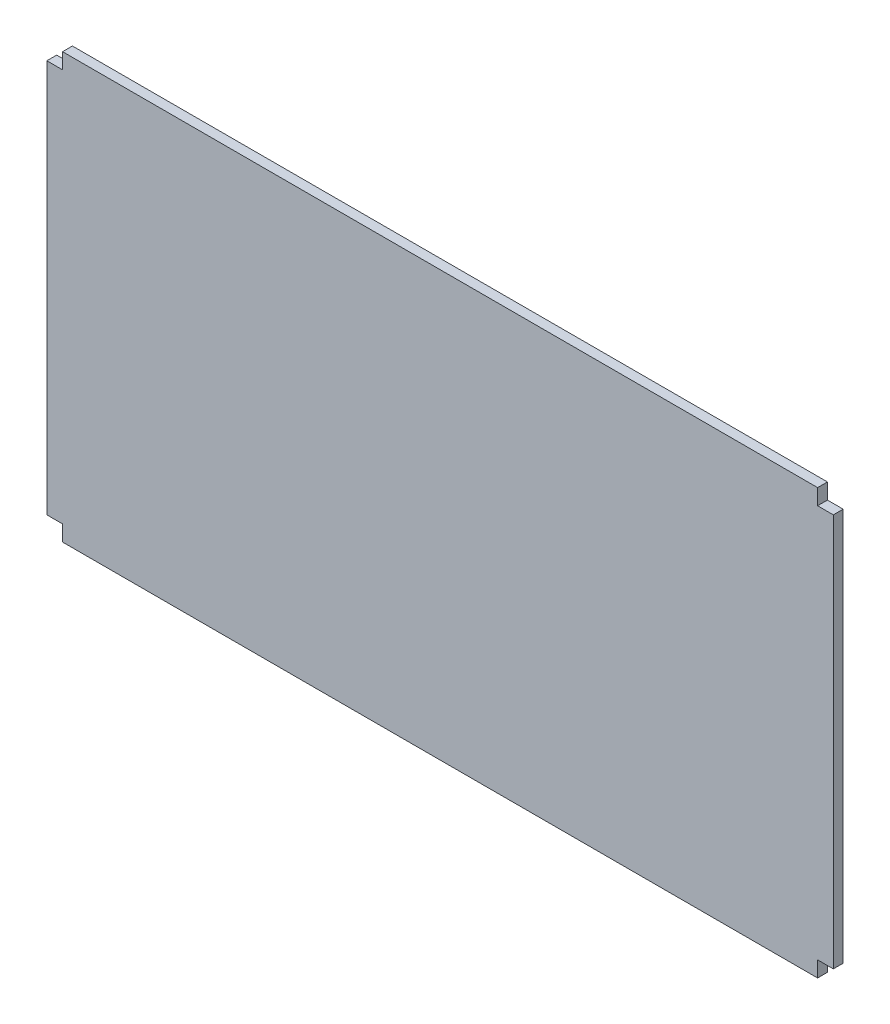
ISO-10303-21;
HEADER;
FILE_DESCRIPTION(('STEP AP214'),'2;1');
FILE_NAME('part.step','',(''),(''),'','','');
FILE_SCHEMA(('AUTOMOTIVE_DESIGN { 1 0 10303 214 1 1 1 1 }'));
ENDSEC;
DATA;
#1=APPLICATION_CONTEXT('core data for automotive mechanical design processes');
#2=APPLICATION_PROTOCOL_DEFINITION('international standard','automotive_design',2000,#1);
#3=PRODUCT_CONTEXT('',#1,'mechanical');
#4=PRODUCT('Part','Part','',(#3));
#5=PRODUCT_RELATED_PRODUCT_CATEGORY('part','',(#4));
#6=PRODUCT_DEFINITION_FORMATION('','',#4);
#7=PRODUCT_DEFINITION_CONTEXT('part definition',#1,'design');
#8=PRODUCT_DEFINITION('design','',#6,#7);
#9=PRODUCT_DEFINITION_SHAPE('','',#8);
#10=(LENGTH_UNIT() NAMED_UNIT(*) SI_UNIT(.MILLI.,.METRE.));
#11=(NAMED_UNIT(*) PLANE_ANGLE_UNIT() SI_UNIT($,.RADIAN.));
#12=(NAMED_UNIT(*) SI_UNIT($,.STERADIAN.) SOLID_ANGLE_UNIT());
#13=UNCERTAINTY_MEASURE_WITH_UNIT(LENGTH_MEASURE(1.E-05),#10,'distance_accuracy_value','');
#14=(GEOMETRIC_REPRESENTATION_CONTEXT(3) GLOBAL_UNCERTAINTY_ASSIGNED_CONTEXT((#13)) GLOBAL_UNIT_ASSIGNED_CONTEXT((#10,
#11,#12)) REPRESENTATION_CONTEXT('',''));
#15=CARTESIAN_POINT('',(0.,0.,0.));
#16=DIRECTION('',(0.,0.,1.));
#17=DIRECTION('',(1.,0.,0.));
#18=AXIS2_PLACEMENT_3D('',#15,#16,#17);
#19=CARTESIAN_POINT('',(-500.,-375.,12.5));
#20=DIRECTION('',(0.,1.,0.));
#21=DIRECTION('',(0.,0.,1.));
#22=AXIS2_PLACEMENT_3D('',#19,#20,#21);
#23=PLANE('',#22);
#24=DIRECTION('',(1.,0.,0.));
#25=VECTOR('',#24,1.);
#26=CARTESIAN_POINT('',(-500.,-375.,0.));
#27=LINE('',#26,#25);
#28=CARTESIAN_POINT('',(-500.,-375.,0.));
#29=VERTEX_POINT('',#28);
#30=CARTESIAN_POINT('',(-480.,-375.,0.));
#31=VERTEX_POINT('',#30);
#32=EDGE_CURVE('E153',#29,#31,#27,.T.);
#33=ORIENTED_EDGE('',*,*,#32,.T.);
#34=DIRECTION('',(0.,0.,-1.));
#35=VECTOR('',#34,1.);
#36=CARTESIAN_POINT('',(-480.,-375.,12.5));
#37=LINE('',#36,#35);
#38=CARTESIAN_POINT('',(-480.,-375.,12.5));
#39=VERTEX_POINT('',#38);
#40=EDGE_CURVE('E11',#39,#31,#37,.T.);
#41=ORIENTED_EDGE('',*,*,#40,.F.);
#42=DIRECTION('',(1.,0.,0.));
#43=VECTOR('',#42,1.);
#44=CARTESIAN_POINT('',(-500.,-375.,12.5));
#45=LINE('',#44,#43);
#46=CARTESIAN_POINT('',(-500.,-375.,12.5));
#47=VERTEX_POINT('',#46);
#48=EDGE_CURVE('E176',#47,#39,#45,.T.);
#49=ORIENTED_EDGE('',*,*,#48,.F.);
#50=DIRECTION('',(0.,0.,-1.));
#51=VECTOR('',#50,1.);
#52=CARTESIAN_POINT('',(-500.,-375.,12.5));
#53=LINE('',#52,#51);
#54=EDGE_CURVE('E149',#47,#29,#53,.T.);
#55=ORIENTED_EDGE('',*,*,#54,.T.);
#56=EDGE_LOOP('',(#33,#41,#49,#55));
#57=FACE_BOUND('',#56,.T.);
#58=ADVANCED_FACE('F32',(#57),#23,.F.);
#59=CARTESIAN_POINT('',(-480.,-375.,12.5));
#60=DIRECTION('',(1.,0.,0.));
#61=DIRECTION('',(0.,0.,-1.));
#62=AXIS2_PLACEMENT_3D('',#59,#60,#61);
#63=PLANE('',#62);
#64=DIRECTION('',(0.,-1.,0.));
#65=VECTOR('',#64,1.);
#66=CARTESIAN_POINT('',(-480.,-375.,0.));
#67=LINE('',#66,#65);
#68=CARTESIAN_POINT('',(-480.,-395.,0.));
#69=VERTEX_POINT('',#68);
#70=EDGE_CURVE('E156',#31,#69,#67,.T.);
#71=ORIENTED_EDGE('',*,*,#70,.T.);
#72=DIRECTION('',(0.,0.,-1.));
#73=VECTOR('',#72,1.);
#74=CARTESIAN_POINT('',(-480.,-395.,12.5));
#75=LINE('',#74,#73);
#76=CARTESIAN_POINT('',(-480.,-395.,12.5));
#77=VERTEX_POINT('',#76);
#78=EDGE_CURVE('E40',#77,#69,#75,.T.);
#79=ORIENTED_EDGE('',*,*,#78,.F.);
#80=DIRECTION('',(0.,-1.,0.));
#81=VECTOR('',#80,1.);
#82=CARTESIAN_POINT('',(-480.,-375.,12.5));
#83=LINE('',#82,#81);
#84=EDGE_CURVE('E101',#39,#77,#83,.T.);
#85=ORIENTED_EDGE('',*,*,#84,.F.);
#86=ORIENTED_EDGE('',*,*,#40,.T.);
#87=EDGE_LOOP('',(#71,#79,#85,#86));
#88=FACE_BOUND('',#87,.T.);
#89=ADVANCED_FACE('F244',(#88),#63,.F.);
#90=CARTESIAN_POINT('',(-480.,-395.,12.5));
#91=DIRECTION('',(0.,1.,0.));
#92=DIRECTION('',(0.,0.,1.));
#93=AXIS2_PLACEMENT_3D('',#90,#91,#92);
#94=PLANE('',#93);
#95=DIRECTION('',(1.,0.,0.));
#96=VECTOR('',#95,1.);
#97=CARTESIAN_POINT('',(-480.,-395.,0.));
#98=LINE('',#97,#96);
#99=CARTESIAN_POINT('',(480.,-395.,0.));
#100=VERTEX_POINT('',#99);
#101=EDGE_CURVE('E158',#69,#100,#98,.T.);
#102=ORIENTED_EDGE('',*,*,#101,.T.);
#103=DIRECTION('',(0.,0.,-1.));
#104=VECTOR('',#103,1.);
#105=CARTESIAN_POINT('',(480.,-395.,12.5));
#106=LINE('',#105,#104);
#107=CARTESIAN_POINT('',(480.,-395.,12.5));
#108=VERTEX_POINT('',#107);
#109=EDGE_CURVE('E195',#108,#100,#106,.T.);
#110=ORIENTED_EDGE('',*,*,#109,.F.);
#111=DIRECTION('',(1.,0.,0.));
#112=VECTOR('',#111,1.);
#113=CARTESIAN_POINT('',(-480.,-395.,12.5));
#114=LINE('',#113,#112);
#115=EDGE_CURVE('E203',#77,#108,#114,.T.);
#116=ORIENTED_EDGE('',*,*,#115,.F.);
#117=ORIENTED_EDGE('',*,*,#78,.T.);
#118=EDGE_LOOP('',(#102,#110,#116,#117));
#119=FACE_BOUND('',#118,.T.);
#120=ADVANCED_FACE('F201',(#119),#94,.F.);
#121=CARTESIAN_POINT('',(480.,-395.,12.5));
#122=DIRECTION('',(-1.,0.,0.));
#123=DIRECTION('',(0.,0.,1.));
#124=AXIS2_PLACEMENT_3D('',#121,#122,#123);
#125=PLANE('',#124);
#126=DIRECTION('',(0.,1.,0.));
#127=VECTOR('',#126,1.);
#128=CARTESIAN_POINT('',(480.,-395.,0.));
#129=LINE('',#128,#127);
#130=CARTESIAN_POINT('',(480.,-375.,0.));
#131=VERTEX_POINT('',#130);
#132=EDGE_CURVE('E160',#100,#131,#129,.T.);
#133=ORIENTED_EDGE('',*,*,#132,.T.);
#134=DIRECTION('',(0.,0.,-1.));
#135=VECTOR('',#134,1.);
#136=CARTESIAN_POINT('',(480.,-375.,12.5));
#137=LINE('',#136,#135);
#138=CARTESIAN_POINT('',(480.,-375.,12.5));
#139=VERTEX_POINT('',#138);
#140=EDGE_CURVE('E192',#139,#131,#137,.T.);
#141=ORIENTED_EDGE('',*,*,#140,.F.);
#142=DIRECTION('',(0.,1.,0.));
#143=VECTOR('',#142,1.);
#144=CARTESIAN_POINT('',(480.,-395.,12.5));
#145=LINE('',#144,#143);
#146=EDGE_CURVE('E219',#108,#139,#145,.T.);
#147=ORIENTED_EDGE('',*,*,#146,.F.);
#148=ORIENTED_EDGE('',*,*,#109,.T.);
#149=EDGE_LOOP('',(#133,#141,#147,#148));
#150=FACE_BOUND('',#149,.T.);
#151=ADVANCED_FACE('F210',(#150),#125,.F.);
#152=CARTESIAN_POINT('',(500.,-375.,12.5));
#153=DIRECTION('',(0.,1.,0.));
#154=DIRECTION('',(0.,0.,1.));
#155=AXIS2_PLACEMENT_3D('',#152,#153,#154);
#156=PLANE('',#155);
#157=DIRECTION('',(1.,0.,0.));
#158=VECTOR('',#157,1.);
#159=CARTESIAN_POINT('',(500.,-375.,0.));
#160=LINE('',#159,#158);
#161=CARTESIAN_POINT('',(500.,-375.,0.));
#162=VERTEX_POINT('',#161);
#163=EDGE_CURVE('E162',#131,#162,#160,.T.);
#164=ORIENTED_EDGE('',*,*,#163,.T.);
#165=DIRECTION('',(0.,0.,-1.));
#166=VECTOR('',#165,1.);
#167=CARTESIAN_POINT('',(500.,-375.,12.5));
#168=LINE('',#167,#166);
#169=CARTESIAN_POINT('',(500.,-375.,12.5));
#170=VERTEX_POINT('',#169);
#171=EDGE_CURVE('E189',#170,#162,#168,.T.);
#172=ORIENTED_EDGE('',*,*,#171,.F.);
#173=DIRECTION('',(1.,0.,0.));
#174=VECTOR('',#173,1.);
#175=CARTESIAN_POINT('',(500.,-375.,12.5));
#176=LINE('',#175,#174);
#177=EDGE_CURVE('E216',#139,#170,#176,.T.);
#178=ORIENTED_EDGE('',*,*,#177,.F.);
#179=ORIENTED_EDGE('',*,*,#140,.T.);
#180=EDGE_LOOP('',(#164,#172,#178,#179));
#181=FACE_BOUND('',#180,.T.);
#182=ADVANCED_FACE('F214',(#181),#156,.F.);
#183=CARTESIAN_POINT('',(500.,125.,12.5));
#184=DIRECTION('',(-1.,0.,0.));
#185=DIRECTION('',(0.,-1.,0.));
#186=AXIS2_PLACEMENT_3D('',#183,#184,#185);
#187=PLANE('',#186);
#188=DIRECTION('',(0.,1.,0.));
#189=VECTOR('',#188,1.);
#190=CARTESIAN_POINT('',(500.,125.,0.));
#191=LINE('',#190,#189);
#192=CARTESIAN_POINT('',(500.,125.,0.));
#193=VERTEX_POINT('',#192);
#194=EDGE_CURVE('E164',#162,#193,#191,.T.);
#195=ORIENTED_EDGE('',*,*,#194,.T.);
#196=DIRECTION('',(0.,0.,-1.));
#197=VECTOR('',#196,1.);
#198=CARTESIAN_POINT('',(500.,125.,12.5));
#199=LINE('',#198,#197);
#200=CARTESIAN_POINT('',(500.,125.,12.5));
#201=VERTEX_POINT('',#200);
#202=EDGE_CURVE('E186',#201,#193,#199,.T.);
#203=ORIENTED_EDGE('',*,*,#202,.F.);
#204=DIRECTION('',(0.,1.,0.));
#205=VECTOR('',#204,1.);
#206=CARTESIAN_POINT('',(500.,125.,12.5));
#207=LINE('',#206,#205);
#208=EDGE_CURVE('E218',#170,#201,#207,.T.);
#209=ORIENTED_EDGE('',*,*,#208,.F.);
#210=ORIENTED_EDGE('',*,*,#171,.T.);
#211=EDGE_LOOP('',(#195,#203,#209,#210));
#212=FACE_BOUND('',#211,.T.);
#213=ADVANCED_FACE('F256',(#212),#187,.F.);
#214=CARTESIAN_POINT('',(480.,125.,12.5));
#215=DIRECTION('',(0.,-1.,0.));
#216=DIRECTION('',(0.,0.,-1.));
#217=AXIS2_PLACEMENT_3D('',#214,#215,#216);
#218=PLANE('',#217);
#219=DIRECTION('',(-1.,0.,0.));
#220=VECTOR('',#219,1.);
#221=CARTESIAN_POINT('',(480.,125.,0.));
#222=LINE('',#221,#220);
#223=CARTESIAN_POINT('',(480.,125.,0.));
#224=VERTEX_POINT('',#223);
#225=EDGE_CURVE('E166',#193,#224,#222,.T.);
#226=ORIENTED_EDGE('',*,*,#225,.T.);
#227=DIRECTION('',(0.,0.,-1.));
#228=VECTOR('',#227,1.);
#229=CARTESIAN_POINT('',(480.,125.,12.5));
#230=LINE('',#229,#228);
#231=CARTESIAN_POINT('',(480.,125.,12.5));
#232=VERTEX_POINT('',#231);
#233=EDGE_CURVE('E183',#232,#224,#230,.T.);
#234=ORIENTED_EDGE('',*,*,#233,.F.);
#235=DIRECTION('',(-1.,0.,0.));
#236=VECTOR('',#235,1.);
#237=CARTESIAN_POINT('',(480.,125.,12.5));
#238=LINE('',#237,#236);
#239=EDGE_CURVE('E221',#201,#232,#238,.T.);
#240=ORIENTED_EDGE('',*,*,#239,.F.);
#241=ORIENTED_EDGE('',*,*,#202,.T.);
#242=EDGE_LOOP('',(#226,#234,#240,#241));
#243=FACE_BOUND('',#242,.T.);
#244=ADVANCED_FACE('F259',(#243),#218,.F.);
#245=CARTESIAN_POINT('',(480.,145.,12.5));
#246=DIRECTION('',(-1.,0.,0.));
#247=DIRECTION('',(0.,0.,1.));
#248=AXIS2_PLACEMENT_3D('',#245,#246,#247);
#249=PLANE('',#248);
#250=DIRECTION('',(0.,1.,0.));
#251=VECTOR('',#250,1.);
#252=CARTESIAN_POINT('',(480.,145.,0.));
#253=LINE('',#252,#251);
#254=CARTESIAN_POINT('',(480.,145.,0.));
#255=VERTEX_POINT('',#254);
#256=EDGE_CURVE('E168',#224,#255,#253,.T.);
#257=ORIENTED_EDGE('',*,*,#256,.T.);
#258=DIRECTION('',(0.,0.,-1.));
#259=VECTOR('',#258,1.);
#260=CARTESIAN_POINT('',(480.,145.,12.5));
#261=LINE('',#260,#259);
#262=CARTESIAN_POINT('',(480.,145.,12.5));
#263=VERTEX_POINT('',#262);
#264=EDGE_CURVE('E180',#263,#255,#261,.T.);
#265=ORIENTED_EDGE('',*,*,#264,.F.);
#266=DIRECTION('',(0.,1.,0.));
#267=VECTOR('',#266,1.);
#268=CARTESIAN_POINT('',(480.,145.,12.5));
#269=LINE('',#268,#267);
#270=EDGE_CURVE('E227',#232,#263,#269,.T.);
#271=ORIENTED_EDGE('',*,*,#270,.F.);
#272=ORIENTED_EDGE('',*,*,#233,.T.);
#273=EDGE_LOOP('',(#257,#265,#271,#272));
#274=FACE_BOUND('',#273,.T.);
#275=ADVANCED_FACE('F233',(#274),#249,.F.);
#276=CARTESIAN_POINT('',(-480.,145.,12.5));
#277=DIRECTION('',(0.,-1.,0.));
#278=DIRECTION('',(0.,0.,-1.));
#279=AXIS2_PLACEMENT_3D('',#276,#277,#278);
#280=PLANE('',#279);
#281=DIRECTION('',(-1.,0.,0.));
#282=VECTOR('',#281,1.);
#283=CARTESIAN_POINT('',(-480.,145.,0.));
#284=LINE('',#283,#282);
#285=CARTESIAN_POINT('',(-480.,145.,0.));
#286=VERTEX_POINT('',#285);
#287=EDGE_CURVE('E170',#255,#286,#284,.T.);
#288=ORIENTED_EDGE('',*,*,#287,.T.);
#289=DIRECTION('',(0.,0.,-1.));
#290=VECTOR('',#289,1.);
#291=CARTESIAN_POINT('',(-480.,145.,12.5));
#292=LINE('',#291,#290);
#293=CARTESIAN_POINT('',(-480.,145.,12.5));
#294=VERTEX_POINT('',#293);
#295=EDGE_CURVE('E144',#294,#286,#292,.T.);
#296=ORIENTED_EDGE('',*,*,#295,.F.);
#297=DIRECTION('',(-1.,0.,0.));
#298=VECTOR('',#297,1.);
#299=CARTESIAN_POINT('',(-480.,145.,12.5));
#300=LINE('',#299,#298);
#301=EDGE_CURVE('E133',#263,#294,#300,.T.);
#302=ORIENTED_EDGE('',*,*,#301,.F.);
#303=ORIENTED_EDGE('',*,*,#264,.T.);
#304=EDGE_LOOP('',(#288,#296,#302,#303));
#305=FACE_BOUND('',#304,.T.);
#306=ADVANCED_FACE('F237',(#305),#280,.F.);
#307=CARTESIAN_POINT('',(-480.,125.,12.5));
#308=DIRECTION('',(1.,0.,0.));
#309=DIRECTION('',(0.,0.,-1.));
#310=AXIS2_PLACEMENT_3D('',#307,#308,#309);
#311=PLANE('',#310);
#312=DIRECTION('',(0.,-1.,0.));
#313=VECTOR('',#312,1.);
#314=CARTESIAN_POINT('',(-480.,125.,0.));
#315=LINE('',#314,#313);
#316=CARTESIAN_POINT('',(-480.,125.,0.));
#317=VERTEX_POINT('',#316);
#318=EDGE_CURVE('E142',#286,#317,#315,.T.);
#319=ORIENTED_EDGE('',*,*,#318,.T.);
#320=DIRECTION('',(0.,0.,-1.));
#321=VECTOR('',#320,1.);
#322=CARTESIAN_POINT('',(-480.,125.,12.5));
#323=LINE('',#322,#321);
#324=CARTESIAN_POINT('',(-480.,125.,12.5));
#325=VERTEX_POINT('',#324);
#326=EDGE_CURVE('E139',#325,#317,#323,.T.);
#327=ORIENTED_EDGE('',*,*,#326,.F.);
#328=DIRECTION('',(0.,-1.,0.));
#329=VECTOR('',#328,1.);
#330=CARTESIAN_POINT('',(-480.,125.,12.5));
#331=LINE('',#330,#329);
#332=EDGE_CURVE('E126',#294,#325,#331,.T.);
#333=ORIENTED_EDGE('',*,*,#332,.F.);
#334=ORIENTED_EDGE('',*,*,#295,.T.);
#335=EDGE_LOOP('',(#319,#327,#333,#334));
#336=FACE_BOUND('',#335,.T.);
#337=ADVANCED_FACE('F140',(#336),#311,.F.);
#338=CARTESIAN_POINT('',(-500.,125.,12.5));
#339=DIRECTION('',(0.,-1.,0.));
#340=DIRECTION('',(0.,0.,-1.));
#341=AXIS2_PLACEMENT_3D('',#338,#339,#340);
#342=PLANE('',#341);
#343=DIRECTION('',(-1.,0.,0.));
#344=VECTOR('',#343,1.);
#345=CARTESIAN_POINT('',(-500.,125.,0.));
#346=LINE('',#345,#344);
#347=CARTESIAN_POINT('',(-500.,125.,0.));
#348=VERTEX_POINT('',#347);
#349=EDGE_CURVE('E173',#317,#348,#346,.T.);
#350=ORIENTED_EDGE('',*,*,#349,.T.);
#351=DIRECTION('',(0.,0.,-1.));
#352=VECTOR('',#351,1.);
#353=CARTESIAN_POINT('',(-500.,125.,12.5));
#354=LINE('',#353,#352);
#355=CARTESIAN_POINT('',(-500.,125.,12.5));
#356=VERTEX_POINT('',#355);
#357=EDGE_CURVE('E145',#356,#348,#354,.T.);
#358=ORIENTED_EDGE('',*,*,#357,.F.);
#359=DIRECTION('',(-1.,0.,0.));
#360=VECTOR('',#359,1.);
#361=CARTESIAN_POINT('',(-500.,125.,12.5));
#362=LINE('',#361,#360);
#363=EDGE_CURVE('E130',#325,#356,#362,.T.);
#364=ORIENTED_EDGE('',*,*,#363,.F.);
#365=ORIENTED_EDGE('',*,*,#326,.T.);
#366=EDGE_LOOP('',(#350,#358,#364,#365));
#367=FACE_BOUND('',#366,.T.);
#368=ADVANCED_FACE('F147',(#367),#342,.F.);
#369=CARTESIAN_POINT('',(-500.,-155.,12.5));
#370=DIRECTION('',(1.,0.,0.));
#371=DIRECTION('',(0.,0.,-1.));
#372=AXIS2_PLACEMENT_3D('',#369,#370,#371);
#373=PLANE('',#372);
#374=DIRECTION('',(0.,-1.,0.));
#375=VECTOR('',#374,1.);
#376=CARTESIAN_POINT('',(-500.,-155.,0.));
#377=LINE('',#376,#375);
#378=EDGE_CURVE('E89',#348,#29,#377,.T.);
#379=ORIENTED_EDGE('',*,*,#378,.T.);
#380=ORIENTED_EDGE('',*,*,#54,.F.);
#381=DIRECTION('',(0.,-1.,0.));
#382=VECTOR('',#381,1.);
#383=CARTESIAN_POINT('',(-500.,-155.,12.5));
#384=LINE('',#383,#382);
#385=EDGE_CURVE('E48',#356,#47,#384,.T.);
#386=ORIENTED_EDGE('',*,*,#385,.F.);
#387=ORIENTED_EDGE('',*,*,#357,.T.);
#388=EDGE_LOOP('',(#379,#380,#386,#387));
#389=FACE_BOUND('',#388,.T.);
#390=ADVANCED_FACE('F238',(#389),#373,.F.);
#391=CARTESIAN_POINT('',(0.,0.,12.5));
#392=DIRECTION('',(0.,0.,-1.));
#393=DIRECTION('',(-1.,0.,0.));
#394=AXIS2_PLACEMENT_3D('',#391,#392,#393);
#395=PLANE('',#394);
#396=ORIENTED_EDGE('',*,*,#48,.T.);
#397=ORIENTED_EDGE('',*,*,#84,.T.);
#398=ORIENTED_EDGE('',*,*,#115,.T.);
#399=ORIENTED_EDGE('',*,*,#146,.T.);
#400=ORIENTED_EDGE('',*,*,#177,.T.);
#401=ORIENTED_EDGE('',*,*,#208,.T.);
#402=ORIENTED_EDGE('',*,*,#239,.T.);
#403=ORIENTED_EDGE('',*,*,#270,.T.);
#404=ORIENTED_EDGE('',*,*,#301,.T.);
#405=ORIENTED_EDGE('',*,*,#332,.T.);
#406=ORIENTED_EDGE('',*,*,#363,.T.);
#407=ORIENTED_EDGE('',*,*,#385,.T.);
#408=EDGE_LOOP('',(#396,#397,#398,#399,#400,#401,#402,#403,#404,#405,#406,#407));
#409=FACE_BOUND('',#408,.T.);
#410=ADVANCED_FACE('F128',(#409),#395,.F.);
#411=CARTESIAN_POINT('',(0.,0.,0.));
#412=DIRECTION('',(0.,0.,-1.));
#413=DIRECTION('',(-1.,0.,0.));
#414=AXIS2_PLACEMENT_3D('',#411,#412,#413);
#415=PLANE('',#414);
#416=ORIENTED_EDGE('',*,*,#32,.F.);
#417=ORIENTED_EDGE('',*,*,#378,.F.);
#418=ORIENTED_EDGE('',*,*,#349,.F.);
#419=ORIENTED_EDGE('',*,*,#318,.F.);
#420=ORIENTED_EDGE('',*,*,#287,.F.);
#421=ORIENTED_EDGE('',*,*,#256,.F.);
#422=ORIENTED_EDGE('',*,*,#225,.F.);
#423=ORIENTED_EDGE('',*,*,#194,.F.);
#424=ORIENTED_EDGE('',*,*,#163,.F.);
#425=ORIENTED_EDGE('',*,*,#132,.F.);
#426=ORIENTED_EDGE('',*,*,#101,.F.);
#427=ORIENTED_EDGE('',*,*,#70,.F.);
#428=EDGE_LOOP('',(#416,#417,#418,#419,#420,#421,#422,#423,#424,#425,#426,#427));
#429=FACE_BOUND('',#428,.T.);
#430=ADVANCED_FACE('F205',(#429),#415,.T.);
#431=CLOSED_SHELL('',(#58,#89,#120,#151,#182,#213,#244,#275,#306,#337,#368,#390,#410,#430));
#432=MANIFOLD_SOLID_BREP('B2',#431);
#433=ADVANCED_BREP_SHAPE_REPRESENTATION('',(#18,#432),#14);
#434=SHAPE_DEFINITION_REPRESENTATION(#9,#433);
ENDSEC;
END-ISO-10303-21;
